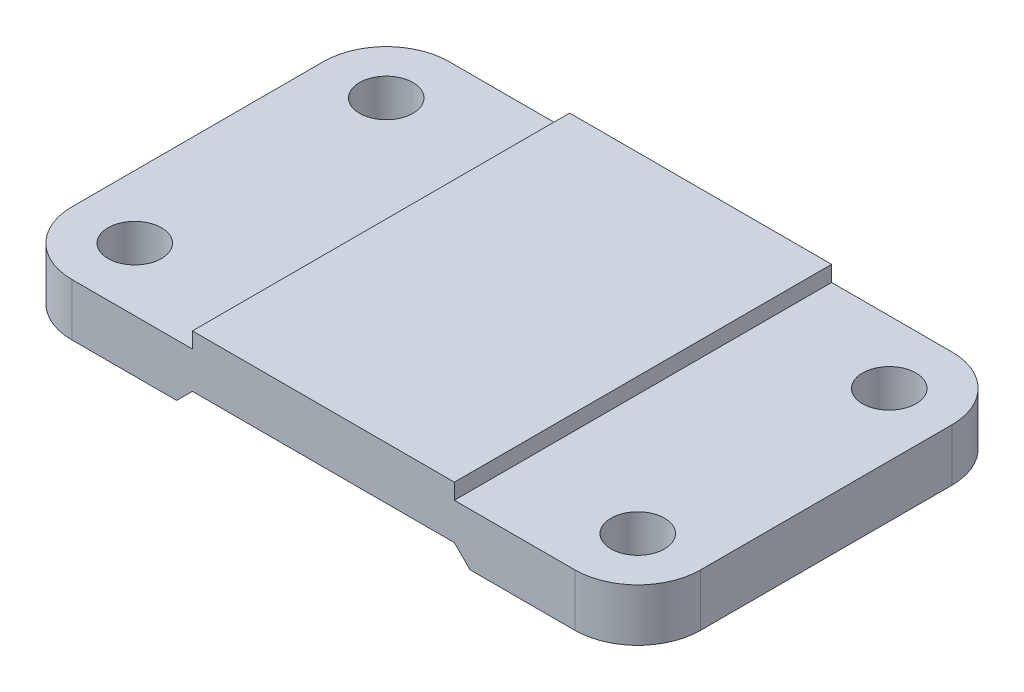
ISO-10303-21;
HEADER;
FILE_DESCRIPTION(('STEP AP214'),'2;1');
FILE_NAME('part.step','',(''),(''),'','','');
FILE_SCHEMA(('AUTOMOTIVE_DESIGN { 1 0 10303 214 1 1 1 1 }'));
ENDSEC;
DATA;
#1=APPLICATION_CONTEXT('core data for automotive mechanical design processes');
#2=APPLICATION_PROTOCOL_DEFINITION('international standard','automotive_design',2000,#1);
#3=PRODUCT_CONTEXT('',#1,'mechanical');
#4=PRODUCT('Part','Part','',(#3));
#5=PRODUCT_RELATED_PRODUCT_CATEGORY('part','',(#4));
#6=PRODUCT_DEFINITION_FORMATION('','',#4);
#7=PRODUCT_DEFINITION_CONTEXT('part definition',#1,'design');
#8=PRODUCT_DEFINITION('design','',#6,#7);
#9=PRODUCT_DEFINITION_SHAPE('','',#8);
#10=(LENGTH_UNIT() NAMED_UNIT(*) SI_UNIT(.MILLI.,.METRE.));
#11=(NAMED_UNIT(*) PLANE_ANGLE_UNIT() SI_UNIT($,.RADIAN.));
#12=(NAMED_UNIT(*) SI_UNIT($,.STERADIAN.) SOLID_ANGLE_UNIT());
#13=UNCERTAINTY_MEASURE_WITH_UNIT(LENGTH_MEASURE(1.E-05),#10,'distance_accuracy_value','');
#14=(GEOMETRIC_REPRESENTATION_CONTEXT(3) GLOBAL_UNCERTAINTY_ASSIGNED_CONTEXT((#13)) GLOBAL_UNIT_ASSIGNED_CONTEXT((#10,
#11,#12)) REPRESENTATION_CONTEXT('',''));
#15=CARTESIAN_POINT('',(0.,0.,0.));
#16=DIRECTION('',(0.,0.,1.));
#17=DIRECTION('',(1.,0.,0.));
#18=AXIS2_PLACEMENT_3D('',#15,#16,#17);
#19=CARTESIAN_POINT('',(35.,10.,72.));
#20=DIRECTION('',(-1.,0.,0.));
#21=DIRECTION('',(0.,0.,1.));
#22=AXIS2_PLACEMENT_3D('',#19,#20,#21);
#23=PLANE('',#22);
#24=DIRECTION('',(0.,1.,0.));
#25=VECTOR('',#24,1.);
#26=CARTESIAN_POINT('',(35.,10.,0.));
#27=LINE('',#26,#25);
#28=CARTESIAN_POINT('',(35.,10.,0.));
#29=VERTEX_POINT('',#28);
#30=CARTESIAN_POINT('',(35.,13.,0.));
#31=VERTEX_POINT('',#30);
#32=EDGE_CURVE('E217',#29,#31,#27,.T.);
#33=ORIENTED_EDGE('',*,*,#32,.F.);
#34=DIRECTION('',(0.,0.,-1.));
#35=VECTOR('',#34,1.);
#36=CARTESIAN_POINT('',(35.,10.,72.));
#37=LINE('',#36,#35);
#38=CARTESIAN_POINT('',(35.,10.,72.));
#39=VERTEX_POINT('',#38);
#40=EDGE_CURVE('E182',#39,#29,#37,.T.);
#41=ORIENTED_EDGE('',*,*,#40,.F.);
#42=DIRECTION('',(0.,1.,0.));
#43=VECTOR('',#42,1.);
#44=CARTESIAN_POINT('',(35.,10.,72.));
#45=LINE('',#44,#43);
#46=CARTESIAN_POINT('',(35.,13.,72.));
#47=VERTEX_POINT('',#46);
#48=EDGE_CURVE('E174',#39,#47,#45,.T.);
#49=ORIENTED_EDGE('',*,*,#48,.T.);
#50=DIRECTION('',(0.,0.,-1.));
#51=VECTOR('',#50,1.);
#52=CARTESIAN_POINT('',(35.,13.,72.));
#53=LINE('',#52,#51);
#54=EDGE_CURVE('E155',#47,#31,#53,.T.);
#55=ORIENTED_EDGE('',*,*,#54,.T.);
#56=EDGE_LOOP('',(#33,#41,#49,#55));
#57=FACE_BOUND('',#56,.T.);
#58=ADVANCED_FACE('F39',(#57),#23,.T.);
#59=CARTESIAN_POINT('',(0.,10.,72.));
#60=DIRECTION('',(0.,1.,0.));
#61=DIRECTION('',(0.,0.,1.));
#62=AXIS2_PLACEMENT_3D('',#59,#60,#61);
#63=PLANE('',#62);
#64=CARTESIAN_POINT('',(12.,10.,60.));
#65=DIRECTION('',(0.,1.,0.));
#66=DIRECTION('',(0.,0.,1.));
#67=AXIS2_PLACEMENT_3D('',#64,#65,#66);
#68=CIRCLE('',#67,5.1);
#69=CARTESIAN_POINT('',(12.,10.,65.1));
#70=VERTEX_POINT('',#69);
#71=EDGE_CURVE('E190',#70,#70,#68,.F.);
#72=ORIENTED_EDGE('',*,*,#71,.T.);
#73=EDGE_LOOP('',(#72));
#74=FACE_BOUND('',#73,.T.);
#75=CARTESIAN_POINT('',(12.,10.,12.));
#76=DIRECTION('',(0.,1.,0.));
#77=DIRECTION('',(0.,0.,1.));
#78=AXIS2_PLACEMENT_3D('',#75,#76,#77);
#79=CIRCLE('',#78,5.1);
#80=CARTESIAN_POINT('',(12.,10.,17.1));
#81=VERTEX_POINT('',#80);
#82=EDGE_CURVE('E337',#81,#81,#79,.F.);
#83=ORIENTED_EDGE('',*,*,#82,.T.);
#84=EDGE_LOOP('',(#83));
#85=FACE_BOUND('',#84,.T.);
#86=DIRECTION('',(1.,0.,0.));
#87=VECTOR('',#86,1.);
#88=CARTESIAN_POINT('',(0.,10.,0.));
#89=LINE('',#88,#87);
#90=CARTESIAN_POINT('',(12.,10.,0.));
#91=VERTEX_POINT('',#90);
#92=EDGE_CURVE('E184',#91,#29,#89,.T.);
#93=ORIENTED_EDGE('',*,*,#92,.F.);
#94=CARTESIAN_POINT('',(12.,10.,12.));
#95=DIRECTION('',(0.,1.,0.));
#96=DIRECTION('',(0.,0.,1.));
#97=AXIS2_PLACEMENT_3D('',#94,#95,#96);
#98=CIRCLE('',#97,12.);
#99=CARTESIAN_POINT('',(0.,10.,12.));
#100=VERTEX_POINT('',#99);
#101=EDGE_CURVE('E293',#91,#100,#98,.T.);
#102=ORIENTED_EDGE('',*,*,#101,.T.);
#103=DIRECTION('',(0.,0.,-1.));
#104=VECTOR('',#103,1.);
#105=CARTESIAN_POINT('',(0.,10.,72.));
#106=LINE('',#105,#104);
#107=CARTESIAN_POINT('',(0.,10.,60.));
#108=VERTEX_POINT('',#107);
#109=EDGE_CURVE('E249',#108,#100,#106,.T.);
#110=ORIENTED_EDGE('',*,*,#109,.F.);
#111=CARTESIAN_POINT('',(12.,10.,60.));
#112=DIRECTION('',(0.,1.,0.));
#113=DIRECTION('',(0.,0.,1.));
#114=AXIS2_PLACEMENT_3D('',#111,#112,#113);
#115=CIRCLE('',#114,12.);
#116=CARTESIAN_POINT('',(12.,10.,72.));
#117=VERTEX_POINT('',#116);
#118=EDGE_CURVE('E290',#108,#117,#115,.T.);
#119=ORIENTED_EDGE('',*,*,#118,.T.);
#120=DIRECTION('',(1.,0.,0.));
#121=VECTOR('',#120,1.);
#122=CARTESIAN_POINT('',(0.,10.,72.));
#123=LINE('',#122,#121);
#124=EDGE_CURVE('E167',#117,#39,#123,.T.);
#125=ORIENTED_EDGE('',*,*,#124,.T.);
#126=ORIENTED_EDGE('',*,*,#40,.T.);
#127=EDGE_LOOP('',(#93,#102,#110,#119,#125,#126));
#128=FACE_BOUND('',#127,.T.);
#129=ADVANCED_FACE('F358',(#74,#85,#128),#63,.T.);
#130=CARTESIAN_POINT('',(0.,0.,72.));
#131=DIRECTION('',(-1.,0.,0.));
#132=DIRECTION('',(0.,0.,1.));
#133=AXIS2_PLACEMENT_3D('',#130,#131,#132);
#134=PLANE('',#133);
#135=ORIENTED_EDGE('',*,*,#109,.T.);
#136=DIRECTION('',(0.,1.,0.));
#137=VECTOR('',#136,1.);
#138=CARTESIAN_POINT('',(0.,0.,12.));
#139=LINE('',#138,#137);
#140=CARTESIAN_POINT('',(0.,0.,12.));
#141=VERTEX_POINT('',#140);
#142=EDGE_CURVE('E300',#100,#141,#139,.F.);
#143=ORIENTED_EDGE('',*,*,#142,.T.);
#144=DIRECTION('',(0.,0.,-1.));
#145=VECTOR('',#144,1.);
#146=CARTESIAN_POINT('',(0.,0.,72.));
#147=LINE('',#146,#145);
#148=CARTESIAN_POINT('',(0.,0.,60.));
#149=VERTEX_POINT('',#148);
#150=EDGE_CURVE('E253',#149,#141,#147,.T.);
#151=ORIENTED_EDGE('',*,*,#150,.F.);
#152=DIRECTION('',(0.,1.,0.));
#153=VECTOR('',#152,1.);
#154=CARTESIAN_POINT('',(0.,10.,60.));
#155=LINE('',#154,#153);
#156=EDGE_CURVE('E296',#149,#108,#155,.T.);
#157=ORIENTED_EDGE('',*,*,#156,.T.);
#158=EDGE_LOOP('',(#135,#143,#151,#157));
#159=FACE_BOUND('',#158,.T.);
#160=ADVANCED_FACE('F370',(#159),#134,.T.);
#161=CARTESIAN_POINT('',(32.,0.,72.));
#162=DIRECTION('',(0.,-1.,0.));
#163=DIRECTION('',(0.,0.,-1.));
#164=AXIS2_PLACEMENT_3D('',#161,#162,#163);
#165=PLANE('',#164);
#166=CARTESIAN_POINT('',(12.,0.,60.));
#167=DIRECTION('',(0.,1.,0.));
#168=DIRECTION('',(0.,0.,1.));
#169=AXIS2_PLACEMENT_3D('',#166,#167,#168);
#170=CIRCLE('',#169,5.1);
#171=CARTESIAN_POINT('',(12.,0.,65.1));
#172=VERTEX_POINT('',#171);
#173=EDGE_CURVE('E339',#172,#172,#170,.T.);
#174=ORIENTED_EDGE('',*,*,#173,.T.);
#175=EDGE_LOOP('',(#174));
#176=FACE_BOUND('',#175,.T.);
#177=CARTESIAN_POINT('',(12.,0.,12.));
#178=DIRECTION('',(0.,1.,0.));
#179=DIRECTION('',(0.,0.,1.));
#180=AXIS2_PLACEMENT_3D('',#177,#178,#179);
#181=CIRCLE('',#180,5.1);
#182=CARTESIAN_POINT('',(12.,0.,17.1));
#183=VERTEX_POINT('',#182);
#184=EDGE_CURVE('E331',#183,#183,#181,.T.);
#185=ORIENTED_EDGE('',*,*,#184,.T.);
#186=EDGE_LOOP('',(#185));
#187=FACE_BOUND('',#186,.T.);
#188=ORIENTED_EDGE('',*,*,#150,.T.);
#189=CARTESIAN_POINT('',(12.,0.,12.));
#190=DIRECTION('',(0.,-1.,0.));
#191=DIRECTION('',(0.,0.,-1.));
#192=AXIS2_PLACEMENT_3D('',#189,#190,#191);
#193=CIRCLE('',#192,12.);
#194=CARTESIAN_POINT('',(12.,0.,0.));
#195=VERTEX_POINT('',#194);
#196=EDGE_CURVE('E306',#141,#195,#193,.T.);
#197=ORIENTED_EDGE('',*,*,#196,.T.);
#198=DIRECTION('',(-1.,0.,0.));
#199=VECTOR('',#198,1.);
#200=CARTESIAN_POINT('',(32.,0.,0.));
#201=LINE('',#200,#199);
#202=CARTESIAN_POINT('',(32.,0.,0.));
#203=VERTEX_POINT('',#202);
#204=EDGE_CURVE('E187',#203,#195,#201,.T.);
#205=ORIENTED_EDGE('',*,*,#204,.F.);
#206=DIRECTION('',(0.,0.,-1.));
#207=VECTOR('',#206,1.);
#208=CARTESIAN_POINT('',(32.,0.,72.));
#209=LINE('',#208,#207);
#210=CARTESIAN_POINT('',(32.,0.,72.));
#211=VERTEX_POINT('',#210);
#212=EDGE_CURVE('E257',#211,#203,#209,.T.);
#213=ORIENTED_EDGE('',*,*,#212,.F.);
#214=DIRECTION('',(-1.,0.,0.));
#215=VECTOR('',#214,1.);
#216=CARTESIAN_POINT('',(32.,0.,72.));
#217=LINE('',#216,#215);
#218=CARTESIAN_POINT('',(12.,0.,72.));
#219=VERTEX_POINT('',#218);
#220=EDGE_CURVE('E211',#211,#219,#217,.T.);
#221=ORIENTED_EDGE('',*,*,#220,.T.);
#222=CARTESIAN_POINT('',(12.,0.,60.));
#223=DIRECTION('',(0.,-1.,0.));
#224=DIRECTION('',(0.,0.,-1.));
#225=AXIS2_PLACEMENT_3D('',#222,#223,#224);
#226=CIRCLE('',#225,12.);
#227=EDGE_CURVE('E303',#219,#149,#226,.T.);
#228=ORIENTED_EDGE('',*,*,#227,.T.);
#229=EDGE_LOOP('',(#188,#197,#205,#213,#221,#228));
#230=FACE_BOUND('',#229,.T.);
#231=ADVANCED_FACE('F367',(#176,#187,#230),#165,.T.);
#232=CARTESIAN_POINT('',(32.,0.,72.));
#233=DIRECTION('',(-0.707106781186548,0.707106781186547,0.));
#234=DIRECTION('',(-0.707106781186547,-0.707106781186548,0.));
#235=AXIS2_PLACEMENT_3D('',#232,#233,#234);
#236=PLANE('',#235);
#237=DIRECTION('',(0.707106781186547,0.707106781186548,0.));
#238=VECTOR('',#237,1.);
#239=CARTESIAN_POINT('',(32.,0.,0.));
#240=LINE('',#239,#238);
#241=CARTESIAN_POINT('',(35.,3.,0.));
#242=VERTEX_POINT('',#241);
#243=EDGE_CURVE('E240',#203,#242,#240,.T.);
#244=ORIENTED_EDGE('',*,*,#243,.T.);
#245=DIRECTION('',(0.,0.,-1.));
#246=VECTOR('',#245,1.);
#247=CARTESIAN_POINT('',(35.,3.,72.));
#248=LINE('',#247,#246);
#249=CARTESIAN_POINT('',(35.,3.,72.));
#250=VERTEX_POINT('',#249);
#251=EDGE_CURVE('E260',#250,#242,#248,.T.);
#252=ORIENTED_EDGE('',*,*,#251,.F.);
#253=DIRECTION('',(0.707106781186547,0.707106781186548,0.));
#254=VECTOR('',#253,1.);
#255=CARTESIAN_POINT('',(32.,0.,72.));
#256=LINE('',#255,#254);
#257=EDGE_CURVE('E208',#211,#250,#256,.T.);
#258=ORIENTED_EDGE('',*,*,#257,.F.);
#259=ORIENTED_EDGE('',*,*,#212,.T.);
#260=EDGE_LOOP('',(#244,#252,#258,#259));
#261=FACE_BOUND('',#260,.T.);
#262=ADVANCED_FACE('F369',(#261),#236,.F.);
#263=CARTESIAN_POINT('',(35.,3.,72.));
#264=DIRECTION('',(0.,1.,0.));
#265=DIRECTION('',(-1.,0.,0.));
#266=AXIS2_PLACEMENT_3D('',#263,#264,#265);
#267=PLANE('',#266);
#268=DIRECTION('',(1.,0.,0.));
#269=VECTOR('',#268,1.);
#270=CARTESIAN_POINT('',(35.,3.,0.));
#271=LINE('',#270,#269);
#272=CARTESIAN_POINT('',(85.,3.00000000000001,0.));
#273=VERTEX_POINT('',#272);
#274=EDGE_CURVE('E237',#242,#273,#271,.T.);
#275=ORIENTED_EDGE('',*,*,#274,.T.);
#276=DIRECTION('',(0.,0.,-1.));
#277=VECTOR('',#276,1.);
#278=CARTESIAN_POINT('',(85.,3.00000000000001,72.));
#279=LINE('',#278,#277);
#280=CARTESIAN_POINT('',(85.,3.00000000000001,72.));
#281=VERTEX_POINT('',#280);
#282=EDGE_CURVE('E264',#281,#273,#279,.T.);
#283=ORIENTED_EDGE('',*,*,#282,.F.);
#284=DIRECTION('',(1.,0.,0.));
#285=VECTOR('',#284,1.);
#286=CARTESIAN_POINT('',(35.,3.,72.));
#287=LINE('',#286,#285);
#288=EDGE_CURVE('E205',#250,#281,#287,.T.);
#289=ORIENTED_EDGE('',*,*,#288,.F.);
#290=ORIENTED_EDGE('',*,*,#251,.T.);
#291=EDGE_LOOP('',(#275,#283,#289,#290));
#292=FACE_BOUND('',#291,.T.);
#293=ADVANCED_FACE('F411',(#292),#267,.F.);
#294=CARTESIAN_POINT('',(85.,3.00000000000001,72.));
#295=DIRECTION('',(0.707106781186543,0.707106781186552,0.));
#296=DIRECTION('',(-0.707106781186552,0.707106781186543,0.));
#297=AXIS2_PLACEMENT_3D('',#294,#295,#296);
#298=PLANE('',#297);
#299=DIRECTION('',(0.707106781186552,-0.707106781186543,0.));
#300=VECTOR('',#299,1.);
#301=CARTESIAN_POINT('',(85.,3.00000000000001,0.));
#302=LINE('',#301,#300);
#303=CARTESIAN_POINT('',(88.,0.,0.));
#304=VERTEX_POINT('',#303);
#305=EDGE_CURVE('E233',#273,#304,#302,.T.);
#306=ORIENTED_EDGE('',*,*,#305,.T.);
#307=DIRECTION('',(0.,0.,-1.));
#308=VECTOR('',#307,1.);
#309=CARTESIAN_POINT('',(88.,0.,72.));
#310=LINE('',#309,#308);
#311=CARTESIAN_POINT('',(88.,0.,72.));
#312=VERTEX_POINT('',#311);
#313=EDGE_CURVE('E268',#312,#304,#310,.T.);
#314=ORIENTED_EDGE('',*,*,#313,.F.);
#315=DIRECTION('',(0.707106781186552,-0.707106781186543,0.));
#316=VECTOR('',#315,1.);
#317=CARTESIAN_POINT('',(85.,3.00000000000001,72.));
#318=LINE('',#317,#316);
#319=EDGE_CURVE('E201',#281,#312,#318,.T.);
#320=ORIENTED_EDGE('',*,*,#319,.F.);
#321=ORIENTED_EDGE('',*,*,#282,.T.);
#322=EDGE_LOOP('',(#306,#314,#320,#321));
#323=FACE_BOUND('',#322,.T.);
#324=ADVANCED_FACE('F407',(#323),#298,.F.);
#325=CARTESIAN_POINT('',(120.,0.,72.));
#326=DIRECTION('',(0.,-1.,0.));
#327=DIRECTION('',(1.,0.,0.));
#328=AXIS2_PLACEMENT_3D('',#325,#326,#327);
#329=PLANE('',#328);
#330=CARTESIAN_POINT('',(108.,0.,12.));
#331=DIRECTION('',(0.,1.,0.));
#332=DIRECTION('',(0.,0.,-1.));
#333=AXIS2_PLACEMENT_3D('',#330,#331,#332);
#334=CIRCLE('',#333,5.1);
#335=CARTESIAN_POINT('',(108.,0.,6.9));
#336=VERTEX_POINT('',#335);
#337=EDGE_CURVE('E348',#336,#336,#334,.T.);
#338=ORIENTED_EDGE('',*,*,#337,.T.);
#339=EDGE_LOOP('',(#338));
#340=FACE_BOUND('',#339,.T.);
#341=CARTESIAN_POINT('',(108.,0.,60.));
#342=DIRECTION('',(0.,1.,0.));
#343=DIRECTION('',(0.,0.,-1.));
#344=AXIS2_PLACEMENT_3D('',#341,#342,#343);
#345=CIRCLE('',#344,5.1);
#346=CARTESIAN_POINT('',(108.,0.,54.9));
#347=VERTEX_POINT('',#346);
#348=EDGE_CURVE('E345',#347,#347,#345,.T.);
#349=ORIENTED_EDGE('',*,*,#348,.T.);
#350=EDGE_LOOP('',(#349));
#351=FACE_BOUND('',#350,.T.);
#352=DIRECTION('',(-1.,0.,0.));
#353=VECTOR('',#352,1.);
#354=CARTESIAN_POINT('',(120.,0.,0.));
#355=LINE('',#354,#353);
#356=CARTESIAN_POINT('',(108.,0.,0.));
#357=VERTEX_POINT('',#356);
#358=EDGE_CURVE('E230',#357,#304,#355,.T.);
#359=ORIENTED_EDGE('',*,*,#358,.F.);
#360=CARTESIAN_POINT('',(108.,0.,12.));
#361=DIRECTION('',(0.,-1.,0.));
#362=DIRECTION('',(1.,0.,0.));
#363=AXIS2_PLACEMENT_3D('',#360,#361,#362);
#364=CIRCLE('',#363,12.);
#365=CARTESIAN_POINT('',(120.,0.,12.));
#366=VERTEX_POINT('',#365);
#367=EDGE_CURVE('E318',#357,#366,#364,.T.);
#368=ORIENTED_EDGE('',*,*,#367,.T.);
#369=DIRECTION('',(0.,0.,-1.));
#370=VECTOR('',#369,1.);
#371=CARTESIAN_POINT('',(120.,0.,72.));
#372=LINE('',#371,#370);
#373=CARTESIAN_POINT('',(120.,0.,60.));
#374=VERTEX_POINT('',#373);
#375=EDGE_CURVE('E272',#374,#366,#372,.T.);
#376=ORIENTED_EDGE('',*,*,#375,.F.);
#377=CARTESIAN_POINT('',(108.,0.,60.));
#378=DIRECTION('',(0.,-1.,0.));
#379=DIRECTION('',(1.,0.,0.));
#380=AXIS2_PLACEMENT_3D('',#377,#378,#379);
#381=CIRCLE('',#380,12.);
#382=CARTESIAN_POINT('',(108.,0.,72.));
#383=VERTEX_POINT('',#382);
#384=EDGE_CURVE('E315',#374,#383,#381,.T.);
#385=ORIENTED_EDGE('',*,*,#384,.T.);
#386=DIRECTION('',(-1.,0.,0.));
#387=VECTOR('',#386,1.);
#388=CARTESIAN_POINT('',(120.,0.,72.));
#389=LINE('',#388,#387);
#390=EDGE_CURVE('E198',#383,#312,#389,.T.);
#391=ORIENTED_EDGE('',*,*,#390,.T.);
#392=ORIENTED_EDGE('',*,*,#313,.T.);
#393=EDGE_LOOP('',(#359,#368,#376,#385,#391,#392));
#394=FACE_BOUND('',#393,.T.);
#395=ADVANCED_FACE('F401',(#340,#351,#394),#329,.T.);
#396=CARTESIAN_POINT('',(120.,10.,72.));
#397=DIRECTION('',(1.,0.,0.));
#398=DIRECTION('',(0.,0.,-1.));
#399=AXIS2_PLACEMENT_3D('',#396,#397,#398);
#400=PLANE('',#399);
#401=ORIENTED_EDGE('',*,*,#375,.T.);
#402=DIRECTION('',(0.,-1.,0.));
#403=VECTOR('',#402,1.);
#404=CARTESIAN_POINT('',(120.,10.,12.));
#405=LINE('',#404,#403);
#406=CARTESIAN_POINT('',(120.,10.,12.));
#407=VERTEX_POINT('',#406);
#408=EDGE_CURVE('E57',#366,#407,#405,.F.);
#409=ORIENTED_EDGE('',*,*,#408,.T.);
#410=DIRECTION('',(0.,0.,-1.));
#411=VECTOR('',#410,1.);
#412=CARTESIAN_POINT('',(120.,10.,72.));
#413=LINE('',#412,#411);
#414=CARTESIAN_POINT('',(120.,10.,60.));
#415=VERTEX_POINT('',#414);
#416=EDGE_CURVE('E275',#415,#407,#413,.T.);
#417=ORIENTED_EDGE('',*,*,#416,.F.);
#418=DIRECTION('',(0.,-1.,0.));
#419=VECTOR('',#418,1.);
#420=CARTESIAN_POINT('',(120.,0.,60.));
#421=LINE('',#420,#419);
#422=EDGE_CURVE('E321',#415,#374,#421,.T.);
#423=ORIENTED_EDGE('',*,*,#422,.T.);
#424=EDGE_LOOP('',(#401,#409,#417,#423));
#425=FACE_BOUND('',#424,.T.);
#426=ADVANCED_FACE('F450',(#425),#400,.T.);
#427=CARTESIAN_POINT('',(85.,10.,72.));
#428=DIRECTION('',(0.,1.,0.));
#429=DIRECTION('',(-1.,0.,0.));
#430=AXIS2_PLACEMENT_3D('',#427,#428,#429);
#431=PLANE('',#430);
#432=CARTESIAN_POINT('',(108.,10.,12.));
#433=DIRECTION('',(0.,1.,0.));
#434=DIRECTION('',(-1.,0.,0.));
#435=AXIS2_PLACEMENT_3D('',#432,#433,#434);
#436=CIRCLE('',#435,5.1);
#437=CARTESIAN_POINT('',(102.9,10.,12.));
#438=VERTEX_POINT('',#437);
#439=EDGE_CURVE('E43',#438,#438,#436,.F.);
#440=ORIENTED_EDGE('',*,*,#439,.T.);
#441=EDGE_LOOP('',(#440));
#442=FACE_BOUND('',#441,.T.);
#443=CARTESIAN_POINT('',(108.,10.,60.));
#444=DIRECTION('',(0.,1.,0.));
#445=DIRECTION('',(-1.,0.,0.));
#446=AXIS2_PLACEMENT_3D('',#443,#444,#445);
#447=CIRCLE('',#446,5.1);
#448=CARTESIAN_POINT('',(102.9,10.,60.));
#449=VERTEX_POINT('',#448);
#450=EDGE_CURVE('E328',#449,#449,#447,.F.);
#451=ORIENTED_EDGE('',*,*,#450,.T.);
#452=EDGE_LOOP('',(#451));
#453=FACE_BOUND('',#452,.T.);
#454=ORIENTED_EDGE('',*,*,#416,.T.);
#455=CARTESIAN_POINT('',(108.,10.,12.));
#456=DIRECTION('',(0.,1.,0.));
#457=DIRECTION('',(-1.,0.,0.));
#458=AXIS2_PLACEMENT_3D('',#455,#456,#457);
#459=CIRCLE('',#458,12.);
#460=CARTESIAN_POINT('',(108.,10.,0.));
#461=VERTEX_POINT('',#460);
#462=EDGE_CURVE('E11',#407,#461,#459,.T.);
#463=ORIENTED_EDGE('',*,*,#462,.T.);
#464=DIRECTION('',(1.,0.,0.));
#465=VECTOR('',#464,1.);
#466=CARTESIAN_POINT('',(85.,10.,0.));
#467=LINE('',#466,#465);
#468=CARTESIAN_POINT('',(85.,10.,0.));
#469=VERTEX_POINT('',#468);
#470=EDGE_CURVE('E226',#469,#461,#467,.T.);
#471=ORIENTED_EDGE('',*,*,#470,.F.);
#472=DIRECTION('',(0.,0.,-1.));
#473=VECTOR('',#472,1.);
#474=CARTESIAN_POINT('',(85.,10.,72.));
#475=LINE('',#474,#473);
#476=CARTESIAN_POINT('',(85.,10.,72.));
#477=VERTEX_POINT('',#476);
#478=EDGE_CURVE('E278',#477,#469,#475,.T.);
#479=ORIENTED_EDGE('',*,*,#478,.F.);
#480=DIRECTION('',(1.,0.,0.));
#481=VECTOR('',#480,1.);
#482=CARTESIAN_POINT('',(85.,10.,72.));
#483=LINE('',#482,#481);
#484=CARTESIAN_POINT('',(108.,10.,72.));
#485=VERTEX_POINT('',#484);
#486=EDGE_CURVE('E195',#477,#485,#483,.T.);
#487=ORIENTED_EDGE('',*,*,#486,.T.);
#488=CARTESIAN_POINT('',(108.,10.,60.));
#489=DIRECTION('',(0.,1.,0.));
#490=DIRECTION('',(-1.,0.,0.));
#491=AXIS2_PLACEMENT_3D('',#488,#489,#490);
#492=CIRCLE('',#491,12.);
#493=EDGE_CURVE('E49',#485,#415,#492,.T.);
#494=ORIENTED_EDGE('',*,*,#493,.T.);
#495=EDGE_LOOP('',(#454,#463,#471,#479,#487,#494));
#496=FACE_BOUND('',#495,.T.);
#497=ADVANCED_FACE('F394',(#442,#453,#496),#431,.T.);
#498=CARTESIAN_POINT('',(85.,13.,72.));
#499=DIRECTION('',(1.,0.,0.));
#500=DIRECTION('',(0.,0.,-1.));
#501=AXIS2_PLACEMENT_3D('',#498,#499,#500);
#502=PLANE('',#501);
#503=DIRECTION('',(0.,-1.,0.));
#504=VECTOR('',#503,1.);
#505=CARTESIAN_POINT('',(85.,13.,0.));
#506=LINE('',#505,#504);
#507=CARTESIAN_POINT('',(85.,13.,0.));
#508=VERTEX_POINT('',#507);
#509=EDGE_CURVE('E222',#508,#469,#506,.T.);
#510=ORIENTED_EDGE('',*,*,#509,.F.);
#511=DIRECTION('',(0.,0.,-1.));
#512=VECTOR('',#511,1.);
#513=CARTESIAN_POINT('',(85.,13.,72.));
#514=LINE('',#513,#512);
#515=CARTESIAN_POINT('',(85.,13.,72.));
#516=VERTEX_POINT('',#515);
#517=EDGE_CURVE('E166',#516,#508,#514,.T.);
#518=ORIENTED_EDGE('',*,*,#517,.F.);
#519=DIRECTION('',(0.,-1.,0.));
#520=VECTOR('',#519,1.);
#521=CARTESIAN_POINT('',(85.,13.,72.));
#522=LINE('',#521,#520);
#523=EDGE_CURVE('E177',#516,#477,#522,.T.);
#524=ORIENTED_EDGE('',*,*,#523,.T.);
#525=ORIENTED_EDGE('',*,*,#478,.T.);
#526=EDGE_LOOP('',(#510,#518,#524,#525));
#527=FACE_BOUND('',#526,.T.);
#528=ADVANCED_FACE('F393',(#527),#502,.T.);
#529=CARTESIAN_POINT('',(35.,13.,72.));
#530=DIRECTION('',(0.,1.,0.));
#531=DIRECTION('',(-1.,0.,0.));
#532=AXIS2_PLACEMENT_3D('',#529,#530,#531);
#533=PLANE('',#532);
#534=DIRECTION('',(1.,0.,0.));
#535=VECTOR('',#534,1.);
#536=CARTESIAN_POINT('',(35.,13.,0.));
#537=LINE('',#536,#535);
#538=EDGE_CURVE('E160',#31,#508,#537,.T.);
#539=ORIENTED_EDGE('',*,*,#538,.F.);
#540=ORIENTED_EDGE('',*,*,#54,.F.);
#541=DIRECTION('',(1.,0.,0.));
#542=VECTOR('',#541,1.);
#543=CARTESIAN_POINT('',(35.,13.,72.));
#544=LINE('',#543,#542);
#545=EDGE_CURVE('E158',#47,#516,#544,.T.);
#546=ORIENTED_EDGE('',*,*,#545,.T.);
#547=ORIENTED_EDGE('',*,*,#517,.T.);
#548=EDGE_LOOP('',(#539,#540,#546,#547));
#549=FACE_BOUND('',#548,.T.);
#550=ADVANCED_FACE('F157',(#549),#533,.T.);
#551=CARTESIAN_POINT('',(0.,0.,72.));
#552=DIRECTION('',(0.,0.,-1.));
#553=DIRECTION('',(-1.,0.,0.));
#554=AXIS2_PLACEMENT_3D('',#551,#552,#553);
#555=PLANE('',#554);
#556=ORIENTED_EDGE('',*,*,#124,.F.);
#557=DIRECTION('',(0.,1.,0.));
#558=VECTOR('',#557,1.);
#559=CARTESIAN_POINT('',(12.,0.,72.));
#560=LINE('',#559,#558);
#561=EDGE_CURVE('E312',#117,#219,#560,.F.);
#562=ORIENTED_EDGE('',*,*,#561,.T.);
#563=ORIENTED_EDGE('',*,*,#220,.F.);
#564=ORIENTED_EDGE('',*,*,#257,.T.);
#565=ORIENTED_EDGE('',*,*,#288,.T.);
#566=ORIENTED_EDGE('',*,*,#319,.T.);
#567=ORIENTED_EDGE('',*,*,#390,.F.);
#568=DIRECTION('',(0.,-1.,0.));
#569=VECTOR('',#568,1.);
#570=CARTESIAN_POINT('',(108.,10.,72.));
#571=LINE('',#570,#569);
#572=EDGE_CURVE('E309',#383,#485,#571,.F.);
#573=ORIENTED_EDGE('',*,*,#572,.T.);
#574=ORIENTED_EDGE('',*,*,#486,.F.);
#575=ORIENTED_EDGE('',*,*,#523,.F.);
#576=ORIENTED_EDGE('',*,*,#545,.F.);
#577=ORIENTED_EDGE('',*,*,#48,.F.);
#578=EDGE_LOOP('',(#556,#562,#563,#564,#565,#566,#567,#573,#574,#575,#576,#577));
#579=FACE_BOUND('',#578,.T.);
#580=ADVANCED_FACE('F173',(#579),#555,.F.);
#581=CARTESIAN_POINT('',(0.,0.,0.));
#582=DIRECTION('',(0.,0.,-1.));
#583=DIRECTION('',(-1.,0.,0.));
#584=AXIS2_PLACEMENT_3D('',#581,#582,#583);
#585=PLANE('',#584);
#586=ORIENTED_EDGE('',*,*,#204,.T.);
#587=DIRECTION('',(0.,1.,0.));
#588=VECTOR('',#587,1.);
#589=CARTESIAN_POINT('',(12.,0.,0.));
#590=LINE('',#589,#588);
#591=EDGE_CURVE('E286',#195,#91,#590,.T.);
#592=ORIENTED_EDGE('',*,*,#591,.T.);
#593=ORIENTED_EDGE('',*,*,#92,.T.);
#594=ORIENTED_EDGE('',*,*,#32,.T.);
#595=ORIENTED_EDGE('',*,*,#538,.T.);
#596=ORIENTED_EDGE('',*,*,#509,.T.);
#597=ORIENTED_EDGE('',*,*,#470,.T.);
#598=DIRECTION('',(0.,-1.,0.));
#599=VECTOR('',#598,1.);
#600=CARTESIAN_POINT('',(108.,0.,0.));
#601=LINE('',#600,#599);
#602=EDGE_CURVE('E248',#461,#357,#601,.T.);
#603=ORIENTED_EDGE('',*,*,#602,.T.);
#604=ORIENTED_EDGE('',*,*,#358,.T.);
#605=ORIENTED_EDGE('',*,*,#305,.F.);
#606=ORIENTED_EDGE('',*,*,#274,.F.);
#607=ORIENTED_EDGE('',*,*,#243,.F.);
#608=EDGE_LOOP('',(#586,#592,#593,#594,#595,#596,#597,#603,#604,#605,#606,#607));
#609=FACE_BOUND('',#608,.T.);
#610=ADVANCED_FACE('F385',(#609),#585,.T.);
#611=CARTESIAN_POINT('',(12.,0.,12.));
#612=DIRECTION('',(0.,1.,0.));
#613=DIRECTION('',(0.,0.,1.));
#614=AXIS2_PLACEMENT_3D('',#611,#612,#613);
#615=CYLINDRICAL_SURFACE('',#614,12.);
#616=ORIENTED_EDGE('',*,*,#196,.F.);
#617=ORIENTED_EDGE('',*,*,#142,.F.);
#618=ORIENTED_EDGE('',*,*,#101,.F.);
#619=ORIENTED_EDGE('',*,*,#591,.F.);
#620=EDGE_LOOP('',(#616,#617,#618,#619));
#621=FACE_BOUND('',#620,.T.);
#622=ADVANCED_FACE('F382',(#621),#615,.T.);
#623=CARTESIAN_POINT('',(12.,0.,60.));
#624=DIRECTION('',(0.,-1.,0.));
#625=DIRECTION('',(0.,0.,-1.));
#626=AXIS2_PLACEMENT_3D('',#623,#624,#625);
#627=CYLINDRICAL_SURFACE('',#626,12.);
#628=ORIENTED_EDGE('',*,*,#227,.F.);
#629=ORIENTED_EDGE('',*,*,#561,.F.);
#630=ORIENTED_EDGE('',*,*,#118,.F.);
#631=ORIENTED_EDGE('',*,*,#156,.F.);
#632=EDGE_LOOP('',(#628,#629,#630,#631));
#633=FACE_BOUND('',#632,.T.);
#634=ADVANCED_FACE('F419',(#633),#627,.T.);
#635=CARTESIAN_POINT('',(108.,0.,12.));
#636=DIRECTION('',(0.,-1.,0.));
#637=DIRECTION('',(0.,0.,-1.));
#638=AXIS2_PLACEMENT_3D('',#635,#636,#637);
#639=CYLINDRICAL_SURFACE('',#638,12.);
#640=ORIENTED_EDGE('',*,*,#462,.F.);
#641=ORIENTED_EDGE('',*,*,#408,.F.);
#642=ORIENTED_EDGE('',*,*,#367,.F.);
#643=ORIENTED_EDGE('',*,*,#602,.F.);
#644=EDGE_LOOP('',(#640,#641,#642,#643));
#645=FACE_BOUND('',#644,.T.);
#646=ADVANCED_FACE('F397',(#645),#639,.T.);
#647=CARTESIAN_POINT('',(108.,10.,60.));
#648=DIRECTION('',(0.,1.,0.));
#649=DIRECTION('',(0.,0.,1.));
#650=AXIS2_PLACEMENT_3D('',#647,#648,#649);
#651=CYLINDRICAL_SURFACE('',#650,12.);
#652=ORIENTED_EDGE('',*,*,#493,.F.);
#653=ORIENTED_EDGE('',*,*,#572,.F.);
#654=ORIENTED_EDGE('',*,*,#384,.F.);
#655=ORIENTED_EDGE('',*,*,#422,.F.);
#656=EDGE_LOOP('',(#652,#653,#654,#655));
#657=FACE_BOUND('',#656,.T.);
#658=ADVANCED_FACE('F41',(#657),#651,.T.);
#659=CARTESIAN_POINT('',(108.,13.,60.));
#660=DIRECTION('',(0.,-1.,0.));
#661=DIRECTION('',(0.,0.,-1.));
#662=AXIS2_PLACEMENT_3D('',#659,#660,#661);
#663=CYLINDRICAL_SURFACE('',#662,5.1);
#664=ORIENTED_EDGE('',*,*,#450,.F.);
#665=EDGE_LOOP('',(#664));
#666=FACE_BOUND('',#665,.T.);
#667=ORIENTED_EDGE('',*,*,#348,.F.);
#668=EDGE_LOOP('',(#667));
#669=FACE_BOUND('',#668,.T.);
#670=ADVANCED_FACE('F440',(#666,#669),#663,.F.);
#671=CARTESIAN_POINT('',(108.,13.,12.));
#672=DIRECTION('',(0.,-1.,0.));
#673=DIRECTION('',(0.,0.,-1.));
#674=AXIS2_PLACEMENT_3D('',#671,#672,#673);
#675=CYLINDRICAL_SURFACE('',#674,5.1);
#676=ORIENTED_EDGE('',*,*,#439,.F.);
#677=EDGE_LOOP('',(#676));
#678=FACE_BOUND('',#677,.T.);
#679=ORIENTED_EDGE('',*,*,#337,.F.);
#680=EDGE_LOOP('',(#679));
#681=FACE_BOUND('',#680,.T.);
#682=ADVANCED_FACE('F445',(#678,#681),#675,.F.);
#683=CARTESIAN_POINT('',(12.,13.,12.));
#684=DIRECTION('',(0.,-1.,0.));
#685=DIRECTION('',(0.,0.,-1.));
#686=AXIS2_PLACEMENT_3D('',#683,#684,#685);
#687=CYLINDRICAL_SURFACE('',#686,5.1);
#688=ORIENTED_EDGE('',*,*,#82,.F.);
#689=EDGE_LOOP('',(#688));
#690=FACE_BOUND('',#689,.T.);
#691=ORIENTED_EDGE('',*,*,#184,.F.);
#692=EDGE_LOOP('',(#691));
#693=FACE_BOUND('',#692,.T.);
#694=ADVANCED_FACE('F363',(#690,#693),#687,.F.);
#695=CARTESIAN_POINT('',(12.,13.,60.));
#696=DIRECTION('',(0.,-1.,0.));
#697=DIRECTION('',(0.,0.,-1.));
#698=AXIS2_PLACEMENT_3D('',#695,#696,#697);
#699=CYLINDRICAL_SURFACE('',#698,5.1);
#700=ORIENTED_EDGE('',*,*,#71,.F.);
#701=EDGE_LOOP('',(#700));
#702=FACE_BOUND('',#701,.T.);
#703=ORIENTED_EDGE('',*,*,#173,.F.);
#704=EDGE_LOOP('',(#703));
#705=FACE_BOUND('',#704,.T.);
#706=ADVANCED_FACE('F360',(#702,#705),#699,.F.);
#707=CLOSED_SHELL('',(#58,#129,#160,#231,#262,#293,#324,#395,#426,#497,#528,#550,#580,#610,#622,
#634,#646,#658,#670,#682,#694,#706));
#708=MANIFOLD_SOLID_BREP('B2',#707);
#709=ADVANCED_BREP_SHAPE_REPRESENTATION('',(#18,#708),#14);
#710=SHAPE_DEFINITION_REPRESENTATION(#9,#709);
ENDSEC;
END-ISO-10303-21;
